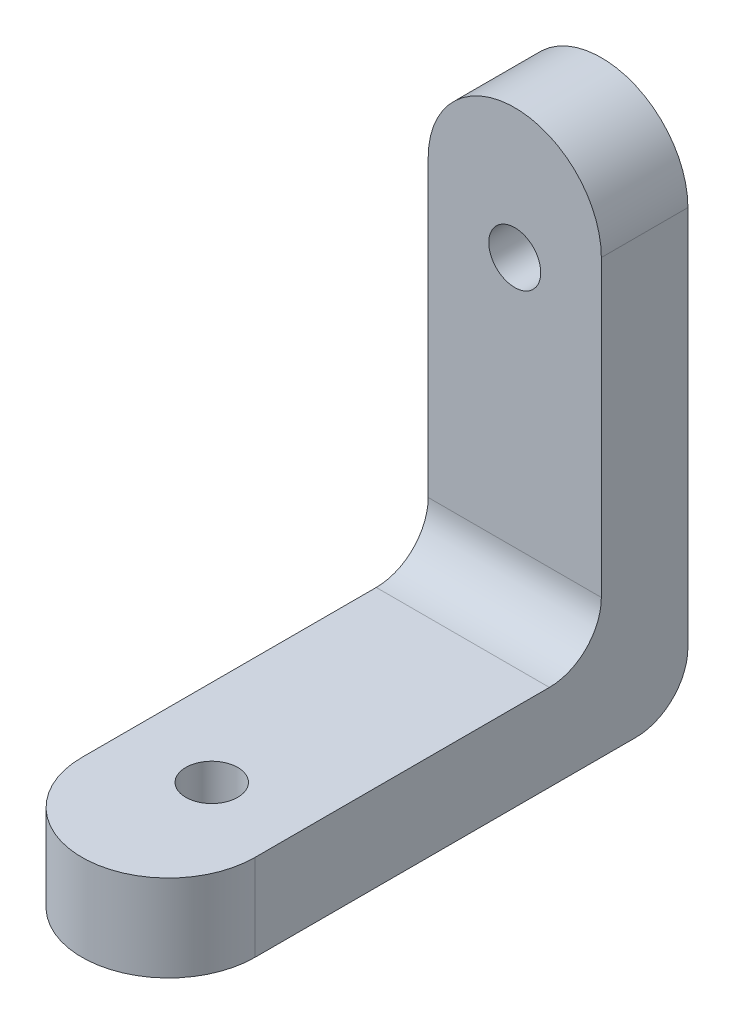
ISO-10303-21;
HEADER;
FILE_DESCRIPTION(('STEP AP214'),'2;1');
FILE_NAME('part.step','',(''),(''),'','','');
FILE_SCHEMA(('AUTOMOTIVE_DESIGN { 1 0 10303 214 1 1 1 1 }'));
ENDSEC;
DATA;
#1=APPLICATION_CONTEXT('core data for automotive mechanical design processes');
#2=APPLICATION_PROTOCOL_DEFINITION('international standard','automotive_design',2000,#1);
#3=PRODUCT_CONTEXT('',#1,'mechanical');
#4=PRODUCT('Part','Part','',(#3));
#5=PRODUCT_RELATED_PRODUCT_CATEGORY('part','',(#4));
#6=PRODUCT_DEFINITION_FORMATION('','',#4);
#7=PRODUCT_DEFINITION_CONTEXT('part definition',#1,'design');
#8=PRODUCT_DEFINITION('design','',#6,#7);
#9=PRODUCT_DEFINITION_SHAPE('','',#8);
#10=(LENGTH_UNIT() NAMED_UNIT(*) SI_UNIT(.MILLI.,.METRE.));
#11=(NAMED_UNIT(*) PLANE_ANGLE_UNIT() SI_UNIT($,.RADIAN.));
#12=(NAMED_UNIT(*) SI_UNIT($,.STERADIAN.) SOLID_ANGLE_UNIT());
#13=UNCERTAINTY_MEASURE_WITH_UNIT(LENGTH_MEASURE(1.E-05),#10,'distance_accuracy_value','');
#14=(GEOMETRIC_REPRESENTATION_CONTEXT(3) GLOBAL_UNCERTAINTY_ASSIGNED_CONTEXT((#13)) GLOBAL_UNIT_ASSIGNED_CONTEXT((#10,
#11,#12)) REPRESENTATION_CONTEXT('',''));
#15=CARTESIAN_POINT('',(0.,0.,0.));
#16=DIRECTION('',(0.,0.,1.));
#17=DIRECTION('',(1.,0.,0.));
#18=AXIS2_PLACEMENT_3D('',#15,#16,#17);
#19=CARTESIAN_POINT('',(-5.,-6.99999999999999,8.));
#20=DIRECTION('',(-1.,0.,0.));
#21=DIRECTION('',(0.,0.,1.));
#22=AXIS2_PLACEMENT_3D('',#19,#20,#21);
#23=CYLINDRICAL_SURFACE('',#22,3.);
#24=DIRECTION('',(-1.,0.,0.));
#25=VECTOR('',#24,1.);
#26=CARTESIAN_POINT('',(-5.,-9.99999999999999,8.));
#27=LINE('',#26,#25);
#28=CARTESIAN_POINT('',(5.,-9.99999999999999,8.));
#29=VERTEX_POINT('',#28);
#30=CARTESIAN_POINT('',(-5.,-9.99999999999999,8.));
#31=VERTEX_POINT('',#30);
#32=EDGE_CURVE('E159',#29,#31,#27,.T.);
#33=ORIENTED_EDGE('',*,*,#32,.F.);
#34=CARTESIAN_POINT('',(5.,-6.99999999999999,8.));
#35=DIRECTION('',(-1.,0.,0.));
#36=DIRECTION('',(0.,-1.,0.));
#37=AXIS2_PLACEMENT_3D('',#34,#35,#36);
#38=CIRCLE('',#37,3.);
#39=CARTESIAN_POINT('',(5.,-7.,5.));
#40=VERTEX_POINT('',#39);
#41=EDGE_CURVE('E42',#29,#40,#38,.F.);
#42=ORIENTED_EDGE('',*,*,#41,.T.);
#43=DIRECTION('',(-1.,0.,0.));
#44=VECTOR('',#43,1.);
#45=CARTESIAN_POINT('',(0.,-6.99999999999999,5.));
#46=LINE('',#45,#44);
#47=CARTESIAN_POINT('',(-5.,-7.,5.));
#48=VERTEX_POINT('',#47);
#49=EDGE_CURVE('E162',#48,#40,#46,.F.);
#50=ORIENTED_EDGE('',*,*,#49,.F.);
#51=CARTESIAN_POINT('',(-5.,-6.99999999999999,8.));
#52=DIRECTION('',(1.,0.,0.));
#53=DIRECTION('',(0.,1.,0.));
#54=AXIS2_PLACEMENT_3D('',#51,#52,#53);
#55=CIRCLE('',#54,3.);
#56=EDGE_CURVE('E11',#48,#31,#55,.F.);
#57=ORIENTED_EDGE('',*,*,#56,.T.);
#58=EDGE_LOOP('',(#33,#42,#50,#57));
#59=FACE_BOUND('',#58,.T.);
#60=ADVANCED_FACE('F35',(#59),#23,.F.);
#61=CARTESIAN_POINT('',(0.,-15.,25.));
#62=DIRECTION('',(0.,-1.,0.));
#63=DIRECTION('',(1.,0.,0.));
#64=AXIS2_PLACEMENT_3D('',#61,#62,#63);
#65=CYLINDRICAL_SURFACE('',#64,5.);
#66=DIRECTION('',(0.,1.,0.));
#67=VECTOR('',#66,1.);
#68=CARTESIAN_POINT('',(-5.,-15.,25.));
#69=LINE('',#68,#67);
#70=CARTESIAN_POINT('',(-5.,-15.,25.));
#71=VERTEX_POINT('',#70);
#72=CARTESIAN_POINT('',(-5.,-9.99999999999999,25.));
#73=VERTEX_POINT('',#72);
#74=EDGE_CURVE('E108',#71,#73,#69,.T.);
#75=ORIENTED_EDGE('',*,*,#74,.F.);
#76=CARTESIAN_POINT('',(0.,-15.,25.));
#77=DIRECTION('',(0.,1.,0.));
#78=DIRECTION('',(0.,0.,1.));
#79=AXIS2_PLACEMENT_3D('',#76,#77,#78);
#80=CIRCLE('',#79,5.);
#81=CARTESIAN_POINT('',(5.,-15.,25.));
#82=VERTEX_POINT('',#81);
#83=EDGE_CURVE('E147',#82,#71,#80,.F.);
#84=ORIENTED_EDGE('',*,*,#83,.F.);
#85=DIRECTION('',(0.,1.,0.));
#86=VECTOR('',#85,1.);
#87=CARTESIAN_POINT('',(5.,-15.,25.));
#88=LINE('',#87,#86);
#89=CARTESIAN_POINT('',(5.,-9.99999999999999,25.));
#90=VERTEX_POINT('',#89);
#91=EDGE_CURVE('E144',#90,#82,#88,.F.);
#92=ORIENTED_EDGE('',*,*,#91,.F.);
#93=CARTESIAN_POINT('',(0.,-9.99999999999999,25.));
#94=DIRECTION('',(0.,-1.,0.));
#95=DIRECTION('',(0.,0.,-1.));
#96=AXIS2_PLACEMENT_3D('',#93,#94,#95);
#97=CIRCLE('',#96,5.);
#98=EDGE_CURVE('E149',#73,#90,#97,.F.);
#99=ORIENTED_EDGE('',*,*,#98,.F.);
#100=EDGE_LOOP('',(#75,#84,#92,#99));
#101=FACE_BOUND('',#100,.T.);
#102=ADVANCED_FACE('F179',(#101),#65,.T.);
#103=CARTESIAN_POINT('',(0.,10.,5.));
#104=DIRECTION('',(0.,0.,-1.));
#105=DIRECTION('',(-1.,0.,0.));
#106=AXIS2_PLACEMENT_3D('',#103,#104,#105);
#107=CYLINDRICAL_SURFACE('',#106,5.);
#108=DIRECTION('',(0.,0.,-1.));
#109=VECTOR('',#108,1.);
#110=CARTESIAN_POINT('',(-5.,10.,5.));
#111=LINE('',#110,#109);
#112=CARTESIAN_POINT('',(-5.,10.,5.));
#113=VERTEX_POINT('',#112);
#114=CARTESIAN_POINT('',(-5.,10.,0.));
#115=VERTEX_POINT('',#114);
#116=EDGE_CURVE('E102',#113,#115,#111,.T.);
#117=ORIENTED_EDGE('',*,*,#116,.F.);
#118=CARTESIAN_POINT('',(0.,10.,5.));
#119=DIRECTION('',(0.,0.,1.));
#120=DIRECTION('',(1.,0.,0.));
#121=AXIS2_PLACEMENT_3D('',#118,#119,#120);
#122=CIRCLE('',#121,5.);
#123=CARTESIAN_POINT('',(5.,10.,5.));
#124=VERTEX_POINT('',#123);
#125=EDGE_CURVE('E109',#124,#113,#122,.T.);
#126=ORIENTED_EDGE('',*,*,#125,.F.);
#127=DIRECTION('',(0.,0.,-1.));
#128=VECTOR('',#127,1.);
#129=CARTESIAN_POINT('',(5.,10.,5.));
#130=LINE('',#129,#128);
#131=CARTESIAN_POINT('',(5.,10.,0.));
#132=VERTEX_POINT('',#131);
#133=EDGE_CURVE('E104',#132,#124,#130,.F.);
#134=ORIENTED_EDGE('',*,*,#133,.F.);
#135=CARTESIAN_POINT('',(0.,10.,0.));
#136=DIRECTION('',(0.,0.,1.));
#137=DIRECTION('',(1.,0.,0.));
#138=AXIS2_PLACEMENT_3D('',#135,#136,#137);
#139=CIRCLE('',#138,5.);
#140=EDGE_CURVE('E98',#115,#132,#139,.F.);
#141=ORIENTED_EDGE('',*,*,#140,.F.);
#142=EDGE_LOOP('',(#117,#126,#134,#141));
#143=FACE_BOUND('',#142,.T.);
#144=ADVANCED_FACE('F100',(#143),#107,.T.);
#145=CARTESIAN_POINT('',(5.,15.,5.));
#146=DIRECTION('',(-1.,0.,0.));
#147=DIRECTION('',(0.,-1.,0.));
#148=AXIS2_PLACEMENT_3D('',#145,#146,#147);
#149=PLANE('',#148);
#150=DIRECTION('',(0.,0.,-1.));
#151=VECTOR('',#150,1.);
#152=CARTESIAN_POINT('',(5.,-15.,5.));
#153=LINE('',#152,#151);
#154=CARTESIAN_POINT('',(5.,-15.,3.));
#155=VERTEX_POINT('',#154);
#156=EDGE_CURVE('E130',#82,#155,#153,.T.);
#157=ORIENTED_EDGE('',*,*,#156,.T.);
#158=CARTESIAN_POINT('',(5.,-12.,3.));
#159=DIRECTION('',(-1.,0.,0.));
#160=DIRECTION('',(0.,-1.,0.));
#161=AXIS2_PLACEMENT_3D('',#158,#159,#160);
#162=CIRCLE('',#161,3.);
#163=CARTESIAN_POINT('',(5.,-12.,0.));
#164=VERTEX_POINT('',#163);
#165=EDGE_CURVE('E154',#155,#164,#162,.F.);
#166=ORIENTED_EDGE('',*,*,#165,.T.);
#167=DIRECTION('',(0.,1.,0.));
#168=VECTOR('',#167,1.);
#169=CARTESIAN_POINT('',(5.,15.,0.));
#170=LINE('',#169,#168);
#171=EDGE_CURVE('E123',#164,#132,#170,.T.);
#172=ORIENTED_EDGE('',*,*,#171,.T.);
#173=ORIENTED_EDGE('',*,*,#133,.T.);
#174=DIRECTION('',(0.,1.,0.));
#175=VECTOR('',#174,1.);
#176=CARTESIAN_POINT('',(5.,15.,5.));
#177=LINE('',#176,#175);
#178=EDGE_CURVE('E122',#40,#124,#177,.T.);
#179=ORIENTED_EDGE('',*,*,#178,.F.);
#180=ORIENTED_EDGE('',*,*,#41,.F.);
#181=DIRECTION('',(0.,0.,-1.));
#182=VECTOR('',#181,1.);
#183=CARTESIAN_POINT('',(5.,-9.99999999999999,30.));
#184=LINE('',#183,#182);
#185=EDGE_CURVE('E126',#90,#29,#184,.T.);
#186=ORIENTED_EDGE('',*,*,#185,.F.);
#187=ORIENTED_EDGE('',*,*,#91,.T.);
#188=EDGE_LOOP('',(#157,#166,#172,#173,#179,#180,#186,#187));
#189=FACE_BOUND('',#188,.T.);
#190=ADVANCED_FACE('F167',(#189),#149,.F.);
#191=CARTESIAN_POINT('',(-5.,15.,5.));
#192=DIRECTION('',(1.,0.,0.));
#193=DIRECTION('',(0.,1.,0.));
#194=AXIS2_PLACEMENT_3D('',#191,#192,#193);
#195=PLANE('',#194);
#196=DIRECTION('',(0.,-1.,0.));
#197=VECTOR('',#196,1.);
#198=CARTESIAN_POINT('',(-5.,15.,0.));
#199=LINE('',#198,#197);
#200=CARTESIAN_POINT('',(-5.,-12.,0.));
#201=VERTEX_POINT('',#200);
#202=EDGE_CURVE('E113',#115,#201,#199,.T.);
#203=ORIENTED_EDGE('',*,*,#202,.T.);
#204=CARTESIAN_POINT('',(-5.,-12.,3.));
#205=DIRECTION('',(1.,0.,0.));
#206=DIRECTION('',(0.,1.,0.));
#207=AXIS2_PLACEMENT_3D('',#204,#205,#206);
#208=CIRCLE('',#207,3.);
#209=CARTESIAN_POINT('',(-5.,-15.,3.));
#210=VERTEX_POINT('',#209);
#211=EDGE_CURVE('E157',#201,#210,#208,.F.);
#212=ORIENTED_EDGE('',*,*,#211,.T.);
#213=DIRECTION('',(0.,0.,-1.));
#214=VECTOR('',#213,1.);
#215=CARTESIAN_POINT('',(-5.,-15.,5.));
#216=LINE('',#215,#214);
#217=EDGE_CURVE('E117',#71,#210,#216,.T.);
#218=ORIENTED_EDGE('',*,*,#217,.F.);
#219=ORIENTED_EDGE('',*,*,#74,.T.);
#220=DIRECTION('',(0.,0.,-1.));
#221=VECTOR('',#220,1.);
#222=CARTESIAN_POINT('',(-5.,-9.99999999999999,30.));
#223=LINE('',#222,#221);
#224=EDGE_CURVE('E137',#73,#31,#223,.T.);
#225=ORIENTED_EDGE('',*,*,#224,.T.);
#226=ORIENTED_EDGE('',*,*,#56,.F.);
#227=DIRECTION('',(0.,-1.,0.));
#228=VECTOR('',#227,1.);
#229=CARTESIAN_POINT('',(-5.,15.,5.));
#230=LINE('',#229,#228);
#231=EDGE_CURVE('E116',#113,#48,#230,.T.);
#232=ORIENTED_EDGE('',*,*,#231,.F.);
#233=ORIENTED_EDGE('',*,*,#116,.T.);
#234=EDGE_LOOP('',(#203,#212,#218,#219,#225,#226,#232,#233));
#235=FACE_BOUND('',#234,.T.);
#236=ADVANCED_FACE('F112',(#235),#195,.F.);
#237=CARTESIAN_POINT('',(-5.,-15.,5.));
#238=DIRECTION('',(0.,1.,0.));
#239=DIRECTION('',(0.,0.,1.));
#240=AXIS2_PLACEMENT_3D('',#237,#238,#239);
#241=PLANE('',#240);
#242=CARTESIAN_POINT('',(0.,-15.,22.5));
#243=DIRECTION('',(0.,1.,0.));
#244=DIRECTION('',(0.,0.,1.));
#245=AXIS2_PLACEMENT_3D('',#242,#243,#244);
#246=CIRCLE('',#245,1.5);
#247=CARTESIAN_POINT('',(0.,-15.,24.));
#248=VERTEX_POINT('',#247);
#249=EDGE_CURVE('E189',#248,#248,#246,.T.);
#250=ORIENTED_EDGE('',*,*,#249,.T.);
#251=EDGE_LOOP('',(#250));
#252=FACE_BOUND('',#251,.T.);
#253=ORIENTED_EDGE('',*,*,#217,.T.);
#254=DIRECTION('',(1.,0.,0.));
#255=VECTOR('',#254,1.);
#256=CARTESIAN_POINT('',(-5.,-15.,3.));
#257=LINE('',#256,#255);
#258=EDGE_CURVE('E151',#210,#155,#257,.T.);
#259=ORIENTED_EDGE('',*,*,#258,.T.);
#260=ORIENTED_EDGE('',*,*,#156,.F.);
#261=ORIENTED_EDGE('',*,*,#83,.T.);
#262=EDGE_LOOP('',(#253,#259,#260,#261));
#263=FACE_BOUND('',#262,.T.);
#264=ADVANCED_FACE('F174',(#252,#263),#241,.F.);
#265=CARTESIAN_POINT('',(0.,0.,5.));
#266=DIRECTION('',(0.,0.,1.));
#267=DIRECTION('',(1.,0.,0.));
#268=AXIS2_PLACEMENT_3D('',#265,#266,#267);
#269=PLANE('',#268);
#270=CARTESIAN_POINT('',(0.,7.50000000000001,5.));
#271=DIRECTION('',(0.,0.,1.));
#272=DIRECTION('',(1.,0.,0.));
#273=AXIS2_PLACEMENT_3D('',#270,#271,#272);
#274=CIRCLE('',#273,1.5);
#275=CARTESIAN_POINT('',(1.5,7.50000000000001,5.));
#276=VERTEX_POINT('',#275);
#277=EDGE_CURVE('E138',#276,#276,#274,.T.);
#278=ORIENTED_EDGE('',*,*,#277,.F.);
#279=EDGE_LOOP('',(#278));
#280=FACE_BOUND('',#279,.T.);
#281=ORIENTED_EDGE('',*,*,#231,.T.);
#282=ORIENTED_EDGE('',*,*,#49,.T.);
#283=ORIENTED_EDGE('',*,*,#178,.T.);
#284=ORIENTED_EDGE('',*,*,#125,.T.);
#285=EDGE_LOOP('',(#281,#282,#283,#284));
#286=FACE_BOUND('',#285,.T.);
#287=ADVANCED_FACE('F165',(#280,#286),#269,.T.);
#288=CARTESIAN_POINT('',(0.,0.,0.));
#289=DIRECTION('',(0.,0.,1.));
#290=DIRECTION('',(1.,0.,0.));
#291=AXIS2_PLACEMENT_3D('',#288,#289,#290);
#292=PLANE('',#291);
#293=CARTESIAN_POINT('',(0.,7.50000000000001,0.));
#294=DIRECTION('',(0.,0.,1.));
#295=DIRECTION('',(1.,0.,0.));
#296=AXIS2_PLACEMENT_3D('',#293,#294,#295);
#297=CIRCLE('',#296,1.5);
#298=CARTESIAN_POINT('',(1.5,7.50000000000001,0.));
#299=VERTEX_POINT('',#298);
#300=EDGE_CURVE('E135',#299,#299,#297,.T.);
#301=ORIENTED_EDGE('',*,*,#300,.T.);
#302=EDGE_LOOP('',(#301));
#303=FACE_BOUND('',#302,.T.);
#304=ORIENTED_EDGE('',*,*,#171,.F.);
#305=DIRECTION('',(1.,0.,0.));
#306=VECTOR('',#305,1.);
#307=CARTESIAN_POINT('',(0.,-12.,0.));
#308=LINE('',#307,#306);
#309=EDGE_CURVE('E121',#164,#201,#308,.F.);
#310=ORIENTED_EDGE('',*,*,#309,.T.);
#311=ORIENTED_EDGE('',*,*,#202,.F.);
#312=ORIENTED_EDGE('',*,*,#140,.T.);
#313=EDGE_LOOP('',(#304,#310,#311,#312));
#314=FACE_BOUND('',#313,.T.);
#315=ADVANCED_FACE('F119',(#303,#314),#292,.F.);
#316=CARTESIAN_POINT('',(-5.,-9.99999999999999,30.));
#317=DIRECTION('',(0.,-1.,0.));
#318=DIRECTION('',(0.,0.,-1.));
#319=AXIS2_PLACEMENT_3D('',#316,#317,#318);
#320=PLANE('',#319);
#321=CARTESIAN_POINT('',(0.,-9.99999999999999,22.5));
#322=DIRECTION('',(0.,1.,0.));
#323=DIRECTION('',(0.,0.,1.));
#324=AXIS2_PLACEMENT_3D('',#321,#322,#323);
#325=CIRCLE('',#324,1.5);
#326=CARTESIAN_POINT('',(0.,-9.99999999999999,24.));
#327=VERTEX_POINT('',#326);
#328=EDGE_CURVE('E192',#327,#327,#325,.T.);
#329=ORIENTED_EDGE('',*,*,#328,.F.);
#330=EDGE_LOOP('',(#329));
#331=FACE_BOUND('',#330,.T.);
#332=ORIENTED_EDGE('',*,*,#185,.T.);
#333=ORIENTED_EDGE('',*,*,#32,.T.);
#334=ORIENTED_EDGE('',*,*,#224,.F.);
#335=ORIENTED_EDGE('',*,*,#98,.T.);
#336=EDGE_LOOP('',(#332,#333,#334,#335));
#337=FACE_BOUND('',#336,.T.);
#338=ADVANCED_FACE('F183',(#331,#337),#320,.F.);
#339=CARTESIAN_POINT('',(0.,7.50000000000001,-25.));
#340=DIRECTION('',(0.,0.,1.));
#341=DIRECTION('',(1.,0.,0.));
#342=AXIS2_PLACEMENT_3D('',#339,#340,#341);
#343=CYLINDRICAL_SURFACE('',#342,1.5);
#344=ORIENTED_EDGE('',*,*,#277,.T.);
#345=EDGE_LOOP('',(#344));
#346=FACE_BOUND('',#345,.T.);
#347=ORIENTED_EDGE('',*,*,#300,.F.);
#348=EDGE_LOOP('',(#347));
#349=FACE_BOUND('',#348,.T.);
#350=ADVANCED_FACE('F200',(#346,#349),#343,.F.);
#351=CARTESIAN_POINT('',(0.,-40.,22.5));
#352=DIRECTION('',(0.,1.,0.));
#353=DIRECTION('',(0.,0.,1.));
#354=AXIS2_PLACEMENT_3D('',#351,#352,#353);
#355=CYLINDRICAL_SURFACE('',#354,1.5);
#356=ORIENTED_EDGE('',*,*,#328,.T.);
#357=EDGE_LOOP('',(#356));
#358=FACE_BOUND('',#357,.T.);
#359=ORIENTED_EDGE('',*,*,#249,.F.);
#360=EDGE_LOOP('',(#359));
#361=FACE_BOUND('',#360,.T.);
#362=ADVANCED_FACE('F196',(#358,#361),#355,.F.);
#363=CARTESIAN_POINT('',(-5.,-12.,3.));
#364=DIRECTION('',(1.,0.,0.));
#365=DIRECTION('',(0.,0.,-1.));
#366=AXIS2_PLACEMENT_3D('',#363,#364,#365);
#367=CYLINDRICAL_SURFACE('',#366,3.);
#368=ORIENTED_EDGE('',*,*,#211,.F.);
#369=ORIENTED_EDGE('',*,*,#309,.F.);
#370=ORIENTED_EDGE('',*,*,#165,.F.);
#371=ORIENTED_EDGE('',*,*,#258,.F.);
#372=EDGE_LOOP('',(#368,#369,#370,#371));
#373=FACE_BOUND('',#372,.T.);
#374=ADVANCED_FACE('F170',(#373),#367,.T.);
#375=CLOSED_SHELL('',(#60,#102,#144,#190,#236,#264,#287,#315,#338,#350,#362,#374));
#376=MANIFOLD_SOLID_BREP('B2',#375);
#377=ADVANCED_BREP_SHAPE_REPRESENTATION('',(#18,#376),#14);
#378=SHAPE_DEFINITION_REPRESENTATION(#9,#377);
ENDSEC;
END-ISO-10303-21;
